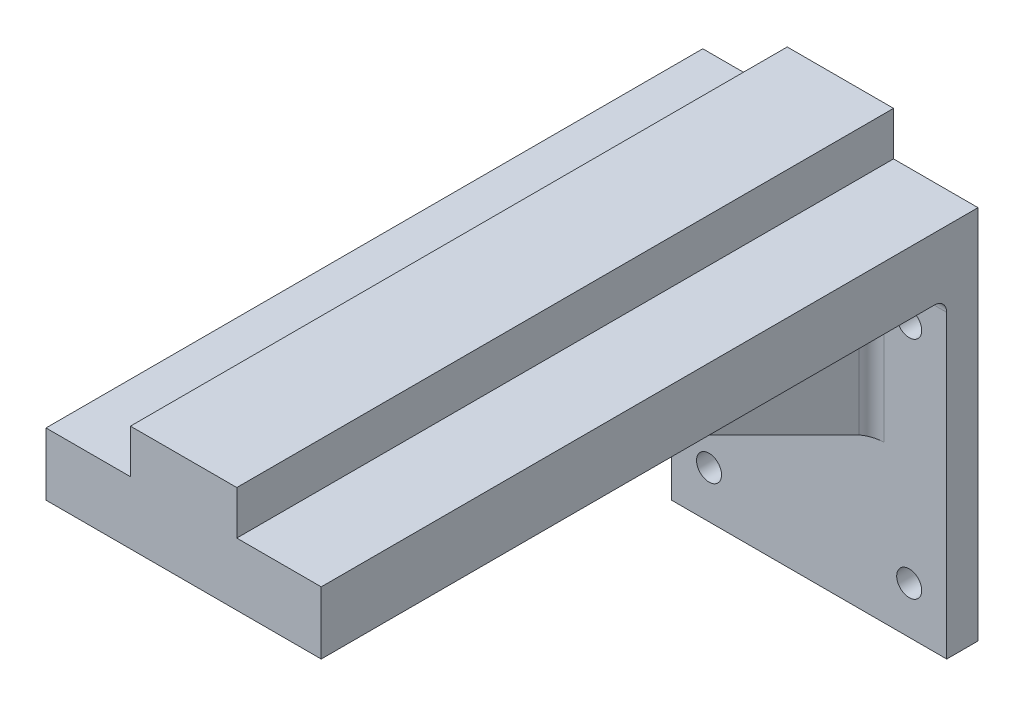
ISO-10303-21;
HEADER;
FILE_DESCRIPTION(('STEP AP214'),'2;1');
FILE_NAME('part.step','',(''),(''),'','','');
FILE_SCHEMA(('AUTOMOTIVE_DESIGN { 1 0 10303 214 1 1 1 1 }'));
ENDSEC;
DATA;
#1=APPLICATION_CONTEXT('core data for automotive mechanical design processes');
#2=APPLICATION_PROTOCOL_DEFINITION('international standard','automotive_design',2000,#1);
#3=PRODUCT_CONTEXT('',#1,'mechanical');
#4=PRODUCT('Part','Part','',(#3));
#5=PRODUCT_RELATED_PRODUCT_CATEGORY('part','',(#4));
#6=PRODUCT_DEFINITION_FORMATION('','',#4);
#7=PRODUCT_DEFINITION_CONTEXT('part definition',#1,'design');
#8=PRODUCT_DEFINITION('design','',#6,#7);
#9=PRODUCT_DEFINITION_SHAPE('','',#8);
#10=(LENGTH_UNIT() NAMED_UNIT(*) SI_UNIT(.MILLI.,.METRE.));
#11=(NAMED_UNIT(*) PLANE_ANGLE_UNIT() SI_UNIT($,.RADIAN.));
#12=(NAMED_UNIT(*) SI_UNIT($,.STERADIAN.) SOLID_ANGLE_UNIT());
#13=UNCERTAINTY_MEASURE_WITH_UNIT(LENGTH_MEASURE(1.E-05),#10,'distance_accuracy_value','');
#14=(GEOMETRIC_REPRESENTATION_CONTEXT(3) GLOBAL_UNCERTAINTY_ASSIGNED_CONTEXT((#13)) GLOBAL_UNIT_ASSIGNED_CONTEXT((#10,
#11,#12)) REPRESENTATION_CONTEXT('',''));
#15=CARTESIAN_POINT('',(0.,0.,0.));
#16=DIRECTION('',(0.,0.,1.));
#17=DIRECTION('',(1.,0.,0.));
#18=AXIS2_PLACEMENT_3D('',#15,#16,#17);
#19=CARTESIAN_POINT('',(-22.,60.,5.));
#20=DIRECTION('',(0.,-1.,0.));
#21=DIRECTION('',(0.,0.,-1.));
#22=AXIS2_PLACEMENT_3D('',#19,#20,#21);
#23=PLANE('',#22);
#24=DIRECTION('',(0.,0.,1.));
#25=VECTOR('',#24,1.);
#26=CARTESIAN_POINT('',(-8.5,60.,105.));
#27=LINE('',#26,#25);
#28=CARTESIAN_POINT('',(-8.5,60.,0.));
#29=VERTEX_POINT('',#28);
#30=CARTESIAN_POINT('',(-8.5,60.,105.));
#31=VERTEX_POINT('',#30);
#32=EDGE_CURVE('E180',#29,#31,#27,.T.);
#33=ORIENTED_EDGE('',*,*,#32,.F.);
#34=DIRECTION('',(-1.,0.,0.));
#35=VECTOR('',#34,1.);
#36=CARTESIAN_POINT('',(-22.,60.,0.));
#37=LINE('',#36,#35);
#38=CARTESIAN_POINT('',(-22.,60.,0.));
#39=VERTEX_POINT('',#38);
#40=EDGE_CURVE('E219',#29,#39,#37,.T.);
#41=ORIENTED_EDGE('',*,*,#40,.T.);
#42=DIRECTION('',(0.,0.,-1.));
#43=VECTOR('',#42,1.);
#44=CARTESIAN_POINT('',(-22.,60.,5.));
#45=LINE('',#44,#43);
#46=CARTESIAN_POINT('',(-22.,60.,105.));
#47=VERTEX_POINT('',#46);
#48=EDGE_CURVE('E243',#47,#39,#45,.T.);
#49=ORIENTED_EDGE('',*,*,#48,.F.);
#50=DIRECTION('',(-1.,0.,0.));
#51=VECTOR('',#50,1.);
#52=CARTESIAN_POINT('',(22.,60.,105.));
#53=LINE('',#52,#51);
#54=EDGE_CURVE('E49',#31,#47,#53,.T.);
#55=ORIENTED_EDGE('',*,*,#54,.F.);
#56=EDGE_LOOP('',(#33,#41,#49,#55));
#57=FACE_BOUND('',#56,.T.);
#58=ADVANCED_FACE('F32',(#57),#23,.F.);
#59=DIRECTION('',(0.,0.,-1.));
#60=VECTOR('',#59,1.);
#61=CARTESIAN_POINT('',(8.5,60.,0.));
#62=LINE('',#61,#60);
#63=CARTESIAN_POINT('',(8.5,60.,105.));
#64=VERTEX_POINT('',#63);
#65=CARTESIAN_POINT('',(8.5,60.,0.));
#66=VERTEX_POINT('',#65);
#67=EDGE_CURVE('E57',#64,#66,#62,.T.);
#68=ORIENTED_EDGE('',*,*,#67,.F.);
#69=CARTESIAN_POINT('',(22.,60.,105.));
#70=VERTEX_POINT('',#69);
#71=EDGE_CURVE('E231',#70,#64,#53,.T.);
#72=ORIENTED_EDGE('',*,*,#71,.F.);
#73=DIRECTION('',(0.,0.,-1.));
#74=VECTOR('',#73,1.);
#75=CARTESIAN_POINT('',(22.,60.,5.));
#76=LINE('',#75,#74);
#77=CARTESIAN_POINT('',(22.,60.,0.));
#78=VERTEX_POINT('',#77);
#79=EDGE_CURVE('E246',#70,#78,#76,.T.);
#80=ORIENTED_EDGE('',*,*,#79,.T.);
#81=EDGE_CURVE('E223',#78,#66,#37,.T.);
#82=ORIENTED_EDGE('',*,*,#81,.T.);
#83=EDGE_LOOP('',(#68,#72,#80,#82));
#84=FACE_BOUND('',#83,.T.);
#85=ADVANCED_FACE('F392',(#84),#23,.F.);
#86=CARTESIAN_POINT('',(0.,0.,5.));
#87=DIRECTION('',(0.,0.,-1.));
#88=DIRECTION('',(-1.,0.,0.));
#89=AXIS2_PLACEMENT_3D('',#86,#87,#88);
#90=PLANE('',#89);
#91=CARTESIAN_POINT('',(16.,43.5,5.));
#92=DIRECTION('',(0.,0.,-1.));
#93=DIRECTION('',(-1.,0.,0.));
#94=AXIS2_PLACEMENT_3D('',#91,#92,#93);
#95=CIRCLE('',#94,2.);
#96=CARTESIAN_POINT('',(14.,43.5,5.));
#97=VERTEX_POINT('',#96);
#98=EDGE_CURVE('E227',#97,#97,#95,.T.);
#99=ORIENTED_EDGE('',*,*,#98,.T.);
#100=EDGE_LOOP('',(#99));
#101=FACE_BOUND('',#100,.T.);
#102=CARTESIAN_POINT('',(-16.,43.5,5.));
#103=DIRECTION('',(0.,0.,-1.));
#104=DIRECTION('',(-1.,0.,0.));
#105=AXIS2_PLACEMENT_3D('',#102,#103,#104);
#106=CIRCLE('',#105,2.);
#107=CARTESIAN_POINT('',(-18.,43.5,5.));
#108=VERTEX_POINT('',#107);
#109=EDGE_CURVE('E362',#108,#108,#106,.T.);
#110=ORIENTED_EDGE('',*,*,#109,.T.);
#111=EDGE_LOOP('',(#110));
#112=FACE_BOUND('',#111,.T.);
#113=CARTESIAN_POINT('',(16.,7.49999999999999,5.));
#114=DIRECTION('',(0.,0.,-1.));
#115=DIRECTION('',(-1.,0.,0.));
#116=AXIS2_PLACEMENT_3D('',#113,#114,#115);
#117=CIRCLE('',#116,2.);
#118=CARTESIAN_POINT('',(14.,7.49999999999999,5.));
#119=VERTEX_POINT('',#118);
#120=EDGE_CURVE('E356',#119,#119,#117,.T.);
#121=ORIENTED_EDGE('',*,*,#120,.T.);
#122=EDGE_LOOP('',(#121));
#123=FACE_BOUND('',#122,.T.);
#124=CARTESIAN_POINT('',(-16.,7.49999999999999,5.));
#125=DIRECTION('',(0.,0.,-1.));
#126=DIRECTION('',(-1.,0.,0.));
#127=AXIS2_PLACEMENT_3D('',#124,#125,#126);
#128=CIRCLE('',#127,2.);
#129=CARTESIAN_POINT('',(-18.,7.49999999999999,5.));
#130=VERTEX_POINT('',#129);
#131=EDGE_CURVE('E339',#130,#130,#128,.T.);
#132=ORIENTED_EDGE('',*,*,#131,.T.);
#133=EDGE_LOOP('',(#132));
#134=FACE_BOUND('',#133,.T.);
#135=DIRECTION('',(0.,1.,0.));
#136=VECTOR('',#135,1.);
#137=CARTESIAN_POINT('',(22.,60.,5.));
#138=LINE('',#137,#136);
#139=CARTESIAN_POINT('',(22.,0.,5.));
#140=VERTEX_POINT('',#139);
#141=CARTESIAN_POINT('',(22.,48.,5.));
#142=VERTEX_POINT('',#141);
#143=EDGE_CURVE('E253',#140,#142,#138,.T.);
#144=ORIENTED_EDGE('',*,*,#143,.T.);
#145=DIRECTION('',(1.,0.,0.));
#146=VECTOR('',#145,1.);
#147=CARTESIAN_POINT('',(10.,48.,5.));
#148=LINE('',#147,#146);
#149=CARTESIAN_POINT('',(12.,48.,5.));
#150=VERTEX_POINT('',#149);
#151=EDGE_CURVE('E275',#142,#150,#148,.F.);
#152=ORIENTED_EDGE('',*,*,#151,.T.);
#153=DIRECTION('',(0.,1.,0.));
#154=VECTOR('',#153,1.);
#155=CARTESIAN_POINT('',(12.,0.,5.));
#156=LINE('',#155,#154);
#157=CARTESIAN_POINT('',(12.,25.,5.));
#158=VERTEX_POINT('',#157);
#159=EDGE_CURVE('E272',#150,#158,#156,.F.);
#160=ORIENTED_EDGE('',*,*,#159,.T.);
#161=DIRECTION('',(-1.,0.,0.));
#162=VECTOR('',#161,1.);
#163=CARTESIAN_POINT('',(10.,25.,5.));
#164=LINE('',#163,#162);
#165=CARTESIAN_POINT('',(-12.,25.,5.));
#166=VERTEX_POINT('',#165);
#167=EDGE_CURVE('E436',#158,#166,#164,.T.);
#168=ORIENTED_EDGE('',*,*,#167,.T.);
#169=DIRECTION('',(0.,1.,0.));
#170=VECTOR('',#169,1.);
#171=CARTESIAN_POINT('',(-12.,50.,5.));
#172=LINE('',#171,#170);
#173=CARTESIAN_POINT('',(-12.,48.,5.));
#174=VERTEX_POINT('',#173);
#175=EDGE_CURVE('E268',#166,#174,#172,.T.);
#176=ORIENTED_EDGE('',*,*,#175,.T.);
#177=DIRECTION('',(1.,0.,0.));
#178=VECTOR('',#177,1.);
#179=CARTESIAN_POINT('',(-22.,48.,5.));
#180=LINE('',#179,#178);
#181=CARTESIAN_POINT('',(-22.,48.,5.));
#182=VERTEX_POINT('',#181);
#183=EDGE_CURVE('E270',#174,#182,#180,.F.);
#184=ORIENTED_EDGE('',*,*,#183,.T.);
#185=DIRECTION('',(0.,-1.,0.));
#186=VECTOR('',#185,1.);
#187=CARTESIAN_POINT('',(-22.,0.,5.));
#188=LINE('',#187,#186);
#189=CARTESIAN_POINT('',(-22.,0.,5.));
#190=VERTEX_POINT('',#189);
#191=EDGE_CURVE('E244',#182,#190,#188,.T.);
#192=ORIENTED_EDGE('',*,*,#191,.T.);
#193=DIRECTION('',(1.,0.,0.));
#194=VECTOR('',#193,1.);
#195=CARTESIAN_POINT('',(22.,0.,5.));
#196=LINE('',#195,#194);
#197=EDGE_CURVE('E239',#190,#140,#196,.T.);
#198=ORIENTED_EDGE('',*,*,#197,.T.);
#199=EDGE_LOOP('',(#144,#152,#160,#168,#176,#184,#192,#198));
#200=FACE_BOUND('',#199,.T.);
#201=ADVANCED_FACE('F397',(#101,#112,#123,#134,#200),#90,.F.);
#202=CARTESIAN_POINT('',(22.,60.,5.));
#203=DIRECTION('',(-1.,0.,0.));
#204=DIRECTION('',(0.,0.,1.));
#205=AXIS2_PLACEMENT_3D('',#202,#203,#204);
#206=PLANE('',#205);
#207=DIRECTION('',(0.,1.,0.));
#208=VECTOR('',#207,1.);
#209=CARTESIAN_POINT('',(22.,60.,0.));
#210=LINE('',#209,#208);
#211=CARTESIAN_POINT('',(22.,0.,0.));
#212=VERTEX_POINT('',#211);
#213=EDGE_CURVE('E224',#212,#78,#210,.T.);
#214=ORIENTED_EDGE('',*,*,#213,.T.);
#215=ORIENTED_EDGE('',*,*,#79,.F.);
#216=DIRECTION('',(0.,1.,0.));
#217=VECTOR('',#216,1.);
#218=CARTESIAN_POINT('',(22.,50.,105.));
#219=LINE('',#218,#217);
#220=CARTESIAN_POINT('',(22.,50.,105.));
#221=VERTEX_POINT('',#220);
#222=EDGE_CURVE('E342',#221,#70,#219,.T.);
#223=ORIENTED_EDGE('',*,*,#222,.F.);
#224=DIRECTION('',(0.,0.,-1.));
#225=VECTOR('',#224,1.);
#226=CARTESIAN_POINT('',(22.,50.,105.));
#227=LINE('',#226,#225);
#228=CARTESIAN_POINT('',(22.,50.,7.00000000000001));
#229=VERTEX_POINT('',#228);
#230=EDGE_CURVE('E257',#221,#229,#227,.T.);
#231=ORIENTED_EDGE('',*,*,#230,.T.);
#232=CARTESIAN_POINT('',(22.,48.,7.00000000000001));
#233=DIRECTION('',(-1.,0.,0.));
#234=DIRECTION('',(0.,0.,1.));
#235=AXIS2_PLACEMENT_3D('',#232,#233,#234);
#236=CIRCLE('',#235,2.);
#237=EDGE_CURVE('E285',#229,#142,#236,.T.);
#238=ORIENTED_EDGE('',*,*,#237,.T.);
#239=ORIENTED_EDGE('',*,*,#143,.F.);
#240=DIRECTION('',(0.,0.,-1.));
#241=VECTOR('',#240,1.);
#242=CARTESIAN_POINT('',(22.,0.,5.));
#243=LINE('',#242,#241);
#244=EDGE_CURVE('E249',#140,#212,#243,.T.);
#245=ORIENTED_EDGE('',*,*,#244,.T.);
#246=EDGE_LOOP('',(#214,#215,#223,#231,#238,#239,#245));
#247=FACE_BOUND('',#246,.T.);
#248=ADVANCED_FACE('F400',(#247),#206,.F.);
#249=CARTESIAN_POINT('',(-22.,0.,5.));
#250=DIRECTION('',(1.,0.,0.));
#251=DIRECTION('',(0.,0.,-1.));
#252=AXIS2_PLACEMENT_3D('',#249,#250,#251);
#253=PLANE('',#252);
#254=DIRECTION('',(0.,-1.,0.));
#255=VECTOR('',#254,1.);
#256=CARTESIAN_POINT('',(-22.,0.,0.));
#257=LINE('',#256,#255);
#258=CARTESIAN_POINT('',(-22.,0.,0.));
#259=VERTEX_POINT('',#258);
#260=EDGE_CURVE('E221',#39,#259,#257,.T.);
#261=ORIENTED_EDGE('',*,*,#260,.T.);
#262=DIRECTION('',(0.,0.,-1.));
#263=VECTOR('',#262,1.);
#264=CARTESIAN_POINT('',(-22.,0.,5.));
#265=LINE('',#264,#263);
#266=EDGE_CURVE('E240',#190,#259,#265,.T.);
#267=ORIENTED_EDGE('',*,*,#266,.F.);
#268=ORIENTED_EDGE('',*,*,#191,.F.);
#269=CARTESIAN_POINT('',(-22.,48.,7.00000000000001));
#270=DIRECTION('',(1.,0.,0.));
#271=DIRECTION('',(0.,0.,-1.));
#272=AXIS2_PLACEMENT_3D('',#269,#270,#271);
#273=CIRCLE('',#272,2.);
#274=CARTESIAN_POINT('',(-22.,50.,7.00000000000001));
#275=VERTEX_POINT('',#274);
#276=EDGE_CURVE('E292',#182,#275,#273,.T.);
#277=ORIENTED_EDGE('',*,*,#276,.T.);
#278=DIRECTION('',(0.,0.,-1.));
#279=VECTOR('',#278,1.);
#280=CARTESIAN_POINT('',(-22.,50.,105.));
#281=LINE('',#280,#279);
#282=CARTESIAN_POINT('',(-22.,50.,105.));
#283=VERTEX_POINT('',#282);
#284=EDGE_CURVE('E328',#283,#275,#281,.T.);
#285=ORIENTED_EDGE('',*,*,#284,.F.);
#286=DIRECTION('',(0.,-1.,0.));
#287=VECTOR('',#286,1.);
#288=CARTESIAN_POINT('',(-22.,60.,105.));
#289=LINE('',#288,#287);
#290=EDGE_CURVE('E349',#47,#283,#289,.T.);
#291=ORIENTED_EDGE('',*,*,#290,.F.);
#292=ORIENTED_EDGE('',*,*,#48,.T.);
#293=EDGE_LOOP('',(#261,#267,#268,#277,#285,#291,#292));
#294=FACE_BOUND('',#293,.T.);
#295=ADVANCED_FACE('F385',(#294),#253,.F.);
#296=CARTESIAN_POINT('',(0.,0.,5.));
#297=DIRECTION('',(0.,1.,0.));
#298=DIRECTION('',(-1.,0.,0.));
#299=AXIS2_PLACEMENT_3D('',#296,#297,#298);
#300=PLANE('',#299);
#301=DIRECTION('',(1.,0.,0.));
#302=VECTOR('',#301,1.);
#303=CARTESIAN_POINT('',(0.,0.,0.));
#304=LINE('',#303,#302);
#305=EDGE_CURVE('E237',#259,#212,#304,.T.);
#306=ORIENTED_EDGE('',*,*,#305,.T.);
#307=ORIENTED_EDGE('',*,*,#244,.F.);
#308=ORIENTED_EDGE('',*,*,#197,.F.);
#309=ORIENTED_EDGE('',*,*,#266,.T.);
#310=EDGE_LOOP('',(#306,#307,#308,#309));
#311=FACE_BOUND('',#310,.T.);
#312=ADVANCED_FACE('F375',(#311),#300,.F.);
#313=CARTESIAN_POINT('',(0.,0.,0.));
#314=DIRECTION('',(0.,0.,-1.));
#315=DIRECTION('',(-1.,0.,0.));
#316=AXIS2_PLACEMENT_3D('',#313,#314,#315);
#317=PLANE('',#316);
#318=CARTESIAN_POINT('',(-16.,7.49999999999999,0.));
#319=DIRECTION('',(0.,0.,-1.));
#320=DIRECTION('',(-1.,0.,0.));
#321=AXIS2_PLACEMENT_3D('',#318,#319,#320);
#322=CIRCLE('',#321,2.);
#323=CARTESIAN_POINT('',(-18.,7.49999999999999,0.));
#324=VERTEX_POINT('',#323);
#325=EDGE_CURVE('E336',#324,#324,#322,.T.);
#326=ORIENTED_EDGE('',*,*,#325,.F.);
#327=EDGE_LOOP('',(#326));
#328=FACE_BOUND('',#327,.T.);
#329=CARTESIAN_POINT('',(16.,7.49999999999999,0.));
#330=DIRECTION('',(0.,0.,-1.));
#331=DIRECTION('',(-1.,0.,0.));
#332=AXIS2_PLACEMENT_3D('',#329,#330,#331);
#333=CIRCLE('',#332,2.);
#334=CARTESIAN_POINT('',(14.,7.49999999999999,0.));
#335=VERTEX_POINT('',#334);
#336=EDGE_CURVE('E354',#335,#335,#333,.T.);
#337=ORIENTED_EDGE('',*,*,#336,.F.);
#338=EDGE_LOOP('',(#337));
#339=FACE_BOUND('',#338,.T.);
#340=CARTESIAN_POINT('',(-16.,43.5,0.));
#341=DIRECTION('',(0.,0.,-1.));
#342=DIRECTION('',(-1.,0.,0.));
#343=AXIS2_PLACEMENT_3D('',#340,#341,#342);
#344=CIRCLE('',#343,2.);
#345=CARTESIAN_POINT('',(-18.,43.5,0.));
#346=VERTEX_POINT('',#345);
#347=EDGE_CURVE('E359',#346,#346,#344,.T.);
#348=ORIENTED_EDGE('',*,*,#347,.F.);
#349=EDGE_LOOP('',(#348));
#350=FACE_BOUND('',#349,.T.);
#351=CARTESIAN_POINT('',(16.,43.5,0.));
#352=DIRECTION('',(0.,0.,-1.));
#353=DIRECTION('',(-1.,0.,0.));
#354=AXIS2_PLACEMENT_3D('',#351,#352,#353);
#355=CIRCLE('',#354,2.);
#356=CARTESIAN_POINT('',(14.,43.5,0.));
#357=VERTEX_POINT('',#356);
#358=EDGE_CURVE('E365',#357,#357,#355,.T.);
#359=ORIENTED_EDGE('',*,*,#358,.F.);
#360=EDGE_LOOP('',(#359));
#361=FACE_BOUND('',#360,.T.);
#362=ORIENTED_EDGE('',*,*,#213,.F.);
#363=ORIENTED_EDGE('',*,*,#305,.F.);
#364=ORIENTED_EDGE('',*,*,#260,.F.);
#365=ORIENTED_EDGE('',*,*,#40,.F.);
#366=DIRECTION('',(0.,-1.,0.));
#367=VECTOR('',#366,1.);
#368=CARTESIAN_POINT('',(-8.5,67.,0.));
#369=LINE('',#368,#367);
#370=CARTESIAN_POINT('',(-8.5,67.,0.));
#371=VERTEX_POINT('',#370);
#372=EDGE_CURVE('E193',#371,#29,#369,.T.);
#373=ORIENTED_EDGE('',*,*,#372,.F.);
#374=DIRECTION('',(-1.,0.,0.));
#375=VECTOR('',#374,1.);
#376=CARTESIAN_POINT('',(-8.5,67.,0.));
#377=LINE('',#376,#375);
#378=CARTESIAN_POINT('',(8.5,67.,0.));
#379=VERTEX_POINT('',#378);
#380=EDGE_CURVE('E174',#379,#371,#377,.T.);
#381=ORIENTED_EDGE('',*,*,#380,.F.);
#382=DIRECTION('',(0.,-1.,0.));
#383=VECTOR('',#382,1.);
#384=CARTESIAN_POINT('',(8.5,67.,0.));
#385=LINE('',#384,#383);
#386=EDGE_CURVE('E185',#379,#66,#385,.T.);
#387=ORIENTED_EDGE('',*,*,#386,.T.);
#388=ORIENTED_EDGE('',*,*,#81,.F.);
#389=EDGE_LOOP('',(#362,#363,#364,#365,#373,#381,#387,#388));
#390=FACE_BOUND('',#389,.T.);
#391=ADVANCED_FACE('F216',(#328,#339,#350,#361,#390),#317,.T.);
#392=CARTESIAN_POINT('',(16.,43.5,5.));
#393=DIRECTION('',(0.,0.,-1.));
#394=DIRECTION('',(-1.,0.,0.));
#395=AXIS2_PLACEMENT_3D('',#392,#393,#394);
#396=CYLINDRICAL_SURFACE('',#395,2.);
#397=ORIENTED_EDGE('',*,*,#98,.F.);
#398=EDGE_LOOP('',(#397));
#399=FACE_BOUND('',#398,.T.);
#400=ORIENTED_EDGE('',*,*,#358,.T.);
#401=EDGE_LOOP('',(#400));
#402=FACE_BOUND('',#401,.T.);
#403=ADVANCED_FACE('F372',(#399,#402),#396,.F.);
#404=CARTESIAN_POINT('',(-16.,43.5,5.));
#405=DIRECTION('',(0.,0.,-1.));
#406=DIRECTION('',(-1.,0.,0.));
#407=AXIS2_PLACEMENT_3D('',#404,#405,#406);
#408=CYLINDRICAL_SURFACE('',#407,2.);
#409=ORIENTED_EDGE('',*,*,#109,.F.);
#410=EDGE_LOOP('',(#409));
#411=FACE_BOUND('',#410,.T.);
#412=ORIENTED_EDGE('',*,*,#347,.T.);
#413=EDGE_LOOP('',(#412));
#414=FACE_BOUND('',#413,.T.);
#415=ADVANCED_FACE('F382',(#411,#414),#408,.F.);
#416=CARTESIAN_POINT('',(16.,7.49999999999999,5.));
#417=DIRECTION('',(0.,0.,-1.));
#418=DIRECTION('',(-1.,0.,0.));
#419=AXIS2_PLACEMENT_3D('',#416,#417,#418);
#420=CYLINDRICAL_SURFACE('',#419,2.);
#421=ORIENTED_EDGE('',*,*,#120,.F.);
#422=EDGE_LOOP('',(#421));
#423=FACE_BOUND('',#422,.T.);
#424=ORIENTED_EDGE('',*,*,#336,.T.);
#425=EDGE_LOOP('',(#424));
#426=FACE_BOUND('',#425,.T.);
#427=ADVANCED_FACE('F487',(#423,#426),#420,.F.);
#428=CARTESIAN_POINT('',(-16.,7.49999999999999,5.));
#429=DIRECTION('',(0.,0.,-1.));
#430=DIRECTION('',(-1.,0.,0.));
#431=AXIS2_PLACEMENT_3D('',#428,#429,#430);
#432=CYLINDRICAL_SURFACE('',#431,2.);
#433=ORIENTED_EDGE('',*,*,#131,.F.);
#434=EDGE_LOOP('',(#433));
#435=FACE_BOUND('',#434,.T.);
#436=ORIENTED_EDGE('',*,*,#325,.T.);
#437=EDGE_LOOP('',(#436));
#438=FACE_BOUND('',#437,.T.);
#439=ADVANCED_FACE('F484',(#435,#438),#432,.F.);
#440=CARTESIAN_POINT('',(-22.,50.,105.));
#441=DIRECTION('',(0.,1.,0.));
#442=DIRECTION('',(0.,0.,1.));
#443=AXIS2_PLACEMENT_3D('',#440,#441,#442);
#444=PLANE('',#443);
#445=DIRECTION('',(0.,0.,1.));
#446=VECTOR('',#445,1.);
#447=CARTESIAN_POINT('',(12.,50.,105.));
#448=LINE('',#447,#446);
#449=CARTESIAN_POINT('',(12.,50.,55.));
#450=VERTEX_POINT('',#449);
#451=CARTESIAN_POINT('',(12.,50.,7.00000000000001));
#452=VERTEX_POINT('',#451);
#453=EDGE_CURVE('E331',#450,#452,#448,.F.);
#454=ORIENTED_EDGE('',*,*,#453,.T.);
#455=DIRECTION('',(1.,0.,0.));
#456=VECTOR('',#455,1.);
#457=CARTESIAN_POINT('',(22.,50.,7.00000000000001));
#458=LINE('',#457,#456);
#459=EDGE_CURVE('E266',#452,#229,#458,.T.);
#460=ORIENTED_EDGE('',*,*,#459,.T.);
#461=ORIENTED_EDGE('',*,*,#230,.F.);
#462=DIRECTION('',(1.,0.,0.));
#463=VECTOR('',#462,1.);
#464=CARTESIAN_POINT('',(-22.,50.,105.));
#465=LINE('',#464,#463);
#466=EDGE_CURVE('E347',#283,#221,#465,.T.);
#467=ORIENTED_EDGE('',*,*,#466,.F.);
#468=ORIENTED_EDGE('',*,*,#284,.T.);
#469=DIRECTION('',(1.,0.,0.));
#470=VECTOR('',#469,1.);
#471=CARTESIAN_POINT('',(-10.,50.,7.00000000000001));
#472=LINE('',#471,#470);
#473=CARTESIAN_POINT('',(-12.,50.,7.00000000000001));
#474=VERTEX_POINT('',#473);
#475=EDGE_CURVE('E321',#275,#474,#472,.T.);
#476=ORIENTED_EDGE('',*,*,#475,.T.);
#477=DIRECTION('',(0.,0.,1.));
#478=VECTOR('',#477,1.);
#479=CARTESIAN_POINT('',(-12.,50.,55.));
#480=LINE('',#479,#478);
#481=CARTESIAN_POINT('',(-12.,50.,55.));
#482=VERTEX_POINT('',#481);
#483=EDGE_CURVE('E252',#474,#482,#480,.T.);
#484=ORIENTED_EDGE('',*,*,#483,.T.);
#485=DIRECTION('',(-1.,0.,0.));
#486=VECTOR('',#485,1.);
#487=CARTESIAN_POINT('',(10.,50.,55.));
#488=LINE('',#487,#486);
#489=EDGE_CURVE('E442',#450,#482,#488,.T.);
#490=ORIENTED_EDGE('',*,*,#489,.F.);
#491=EDGE_LOOP('',(#454,#460,#461,#467,#468,#476,#484,#490));
#492=FACE_BOUND('',#491,.T.);
#493=ADVANCED_FACE('F325',(#492),#444,.F.);
#494=CARTESIAN_POINT('',(0.,0.,105.));
#495=DIRECTION('',(0.,0.,1.));
#496=DIRECTION('',(1.,0.,0.));
#497=AXIS2_PLACEMENT_3D('',#494,#495,#496);
#498=PLANE('',#497);
#499=ORIENTED_EDGE('',*,*,#71,.T.);
#500=DIRECTION('',(0.,-1.,0.));
#501=VECTOR('',#500,1.);
#502=CARTESIAN_POINT('',(8.5,67.,105.));
#503=LINE('',#502,#501);
#504=CARTESIAN_POINT('',(8.5,67.,105.));
#505=VERTEX_POINT('',#504);
#506=EDGE_CURVE('E165',#505,#64,#503,.T.);
#507=ORIENTED_EDGE('',*,*,#506,.F.);
#508=DIRECTION('',(1.,0.,0.));
#509=VECTOR('',#508,1.);
#510=CARTESIAN_POINT('',(8.5,67.,105.));
#511=LINE('',#510,#509);
#512=CARTESIAN_POINT('',(-8.5,67.,105.));
#513=VERTEX_POINT('',#512);
#514=EDGE_CURVE('E158',#513,#505,#511,.T.);
#515=ORIENTED_EDGE('',*,*,#514,.F.);
#516=DIRECTION('',(0.,-1.,0.));
#517=VECTOR('',#516,1.);
#518=CARTESIAN_POINT('',(-8.5,67.,105.));
#519=LINE('',#518,#517);
#520=EDGE_CURVE('E162',#513,#31,#519,.T.);
#521=ORIENTED_EDGE('',*,*,#520,.T.);
#522=ORIENTED_EDGE('',*,*,#54,.T.);
#523=ORIENTED_EDGE('',*,*,#290,.T.);
#524=ORIENTED_EDGE('',*,*,#466,.T.);
#525=ORIENTED_EDGE('',*,*,#222,.T.);
#526=EDGE_LOOP('',(#499,#507,#515,#521,#522,#523,#524,#525));
#527=FACE_BOUND('',#526,.T.);
#528=ADVANCED_FACE('F160',(#527),#498,.T.);
#529=CARTESIAN_POINT('',(10.,50.,55.));
#530=DIRECTION('',(0.,0.894427190999916,-0.447213595499958));
#531=DIRECTION('',(0.,0.447213595499958,0.894427190999916));
#532=AXIS2_PLACEMENT_3D('',#529,#530,#531);
#533=PLANE('',#532);
#534=ORIENTED_EDGE('',*,*,#489,.T.);
#535=CARTESIAN_POINT('',(-12.,48.,51.));
#536=DIRECTION('',(0.,0.894427190999916,-0.447213595499958));
#537=DIRECTION('',(0.,-0.447213595499958,-0.894427190999916));
#538=AXIS2_PLACEMENT_3D('',#535,#536,#537);
#539=ELLIPSE('',#538,4.47213595499958,2.);
#540=CARTESIAN_POINT('',(-10.,48.,51.));
#541=VERTEX_POINT('',#540);
#542=EDGE_CURVE('E11',#482,#541,#539,.T.);
#543=ORIENTED_EDGE('',*,*,#542,.T.);
#544=DIRECTION('',(0.,-0.447213595499958,-0.894427190999916));
#545=VECTOR('',#544,1.);
#546=CARTESIAN_POINT('',(-10.,50.,55.));
#547=LINE('',#546,#545);
#548=CARTESIAN_POINT('',(-10.,26.,7.));
#549=VERTEX_POINT('',#548);
#550=EDGE_CURVE('E305',#541,#549,#547,.T.);
#551=ORIENTED_EDGE('',*,*,#550,.T.);
#552=CARTESIAN_POINT('',(-12.,26.,7.));
#553=DIRECTION('',(0.,0.894427190999916,-0.447213595499958));
#554=DIRECTION('',(0.,-0.447213595499958,-0.894427190999916));
#555=AXIS2_PLACEMENT_3D('',#552,#553,#554);
#556=ELLIPSE('',#555,2.23606797749979,2.);
#557=EDGE_CURVE('E41',#549,#166,#556,.T.);
#558=ORIENTED_EDGE('',*,*,#557,.T.);
#559=ORIENTED_EDGE('',*,*,#167,.F.);
#560=CARTESIAN_POINT('',(12.,26.,7.));
#561=DIRECTION('',(0.,0.894427190999916,-0.447213595499958));
#562=DIRECTION('',(0.,0.447213595499958,0.894427190999916));
#563=AXIS2_PLACEMENT_3D('',#560,#561,#562);
#564=ELLIPSE('',#563,2.23606797749979,2.);
#565=CARTESIAN_POINT('',(10.,26.,7.));
#566=VERTEX_POINT('',#565);
#567=EDGE_CURVE('E287',#158,#566,#564,.T.);
#568=ORIENTED_EDGE('',*,*,#567,.T.);
#569=DIRECTION('',(0.,-0.447213595499958,-0.894427190999916));
#570=VECTOR('',#569,1.);
#571=CARTESIAN_POINT('',(10.,50.,55.));
#572=LINE('',#571,#570);
#573=CARTESIAN_POINT('',(10.,48.,51.));
#574=VERTEX_POINT('',#573);
#575=EDGE_CURVE('E200',#574,#566,#572,.T.);
#576=ORIENTED_EDGE('',*,*,#575,.F.);
#577=CARTESIAN_POINT('',(12.,48.,51.));
#578=DIRECTION('',(0.,0.894427190999916,-0.447213595499958));
#579=DIRECTION('',(0.,0.447213595499958,0.894427190999916));
#580=AXIS2_PLACEMENT_3D('',#577,#578,#579);
#581=ELLIPSE('',#580,4.47213595499958,2.);
#582=EDGE_CURVE('E289',#574,#450,#581,.T.);
#583=ORIENTED_EDGE('',*,*,#582,.T.);
#584=EDGE_LOOP('',(#534,#543,#551,#558,#559,#568,#576,#583));
#585=FACE_BOUND('',#584,.T.);
#586=ADVANCED_FACE('F435',(#585),#533,.F.);
#587=CARTESIAN_POINT('',(10.,0.,0.));
#588=DIRECTION('',(1.,0.,0.));
#589=DIRECTION('',(0.,0.,-1.));
#590=AXIS2_PLACEMENT_3D('',#587,#588,#589);
#591=PLANE('',#590);
#592=ORIENTED_EDGE('',*,*,#575,.T.);
#593=DIRECTION('',(0.,1.,0.));
#594=VECTOR('',#593,1.);
#595=CARTESIAN_POINT('',(10.,0.,7.));
#596=LINE('',#595,#594);
#597=CARTESIAN_POINT('',(10.,48.,7.));
#598=VERTEX_POINT('',#597);
#599=EDGE_CURVE('E279',#566,#598,#596,.T.);
#600=ORIENTED_EDGE('',*,*,#599,.T.);
#601=DIRECTION('',(0.,0.,1.));
#602=VECTOR('',#601,1.);
#603=CARTESIAN_POINT('',(10.,48.,0.));
#604=LINE('',#603,#602);
#605=EDGE_CURVE('E277',#598,#574,#604,.T.);
#606=ORIENTED_EDGE('',*,*,#605,.T.);
#607=EDGE_LOOP('',(#592,#600,#606));
#608=FACE_BOUND('',#607,.T.);
#609=ADVANCED_FACE('F464',(#608),#591,.T.);
#610=CARTESIAN_POINT('',(-10.,0.,0.));
#611=DIRECTION('',(1.,0.,0.));
#612=DIRECTION('',(0.,0.,-1.));
#613=AXIS2_PLACEMENT_3D('',#610,#611,#612);
#614=PLANE('',#613);
#615=DIRECTION('',(0.,0.,1.));
#616=VECTOR('',#615,1.);
#617=CARTESIAN_POINT('',(-10.,48.,5.));
#618=LINE('',#617,#616);
#619=CARTESIAN_POINT('',(-10.,48.,7.));
#620=VERTEX_POINT('',#619);
#621=EDGE_CURVE('E281',#541,#620,#618,.F.);
#622=ORIENTED_EDGE('',*,*,#621,.T.);
#623=DIRECTION('',(0.,1.,0.));
#624=VECTOR('',#623,1.);
#625=CARTESIAN_POINT('',(-10.,25.,7.));
#626=LINE('',#625,#624);
#627=EDGE_CURVE('E283',#620,#549,#626,.F.);
#628=ORIENTED_EDGE('',*,*,#627,.T.);
#629=ORIENTED_EDGE('',*,*,#550,.F.);
#630=EDGE_LOOP('',(#622,#628,#629));
#631=FACE_BOUND('',#630,.T.);
#632=ADVANCED_FACE('F418',(#631),#614,.F.);
#633=CARTESIAN_POINT('',(12.,0.,7.));
#634=DIRECTION('',(0.,1.,0.));
#635=DIRECTION('',(0.,0.,1.));
#636=AXIS2_PLACEMENT_3D('',#633,#634,#635);
#637=CYLINDRICAL_SURFACE('',#636,2.);
#638=ORIENTED_EDGE('',*,*,#567,.F.);
#639=ORIENTED_EDGE('',*,*,#159,.F.);
#640=CARTESIAN_POINT('',(12.,48.,7.));
#641=DIRECTION('',(0.,-1.,0.));
#642=DIRECTION('',(0.,0.,-1.));
#643=AXIS2_PLACEMENT_3D('',#640,#641,#642);
#644=CIRCLE('',#643,2.);
#645=EDGE_CURVE('E303',#598,#150,#644,.T.);
#646=ORIENTED_EDGE('',*,*,#645,.F.);
#647=ORIENTED_EDGE('',*,*,#599,.F.);
#648=EDGE_LOOP('',(#638,#639,#646,#647));
#649=FACE_BOUND('',#648,.T.);
#650=ADVANCED_FACE('F414',(#649),#637,.F.);
#651=CARTESIAN_POINT('',(12.,48.,0.));
#652=DIRECTION('',(0.,0.,1.));
#653=DIRECTION('',(1.,0.,0.));
#654=AXIS2_PLACEMENT_3D('',#651,#652,#653);
#655=CYLINDRICAL_SURFACE('',#654,2.);
#656=ORIENTED_EDGE('',*,*,#582,.F.);
#657=ORIENTED_EDGE('',*,*,#605,.F.);
#658=CARTESIAN_POINT('',(12.,48.,7.00000000000001));
#659=DIRECTION('',(0.,0.,1.));
#660=DIRECTION('',(1.,0.,0.));
#661=AXIS2_PLACEMENT_3D('',#658,#659,#660);
#662=CIRCLE('',#661,2.);
#663=EDGE_CURVE('E299',#452,#598,#662,.T.);
#664=ORIENTED_EDGE('',*,*,#663,.F.);
#665=ORIENTED_EDGE('',*,*,#453,.F.);
#666=EDGE_LOOP('',(#656,#657,#664,#665));
#667=FACE_BOUND('',#666,.T.);
#668=ADVANCED_FACE('F410',(#667),#655,.F.);
#669=CARTESIAN_POINT('',(12.,48.,7.));
#670=DIRECTION('',(0.,0.,1.));
#671=DIRECTION('',(1.,0.,0.));
#672=AXIS2_PLACEMENT_3D('',#669,#670,#671);
#673=SPHERICAL_SURFACE('',#672,2.);
#674=ORIENTED_EDGE('',*,*,#663,.T.);
#675=ORIENTED_EDGE('',*,*,#645,.T.);
#676=CARTESIAN_POINT('',(12.,48.,7.));
#677=DIRECTION('',(1.,0.,0.));
#678=DIRECTION('',(0.,0.,-1.));
#679=AXIS2_PLACEMENT_3D('',#676,#677,#678);
#680=CIRCLE('',#679,2.);
#681=EDGE_CURVE('E296',#452,#150,#680,.F.);
#682=ORIENTED_EDGE('',*,*,#681,.F.);
#683=EDGE_LOOP('',(#674,#675,#682));
#684=FACE_BOUND('',#683,.T.);
#685=ADVANCED_FACE('F406',(#684),#673,.F.);
#686=CARTESIAN_POINT('',(-22.,48.,7.00000000000001));
#687=DIRECTION('',(-1.,0.,0.));
#688=DIRECTION('',(0.,0.,1.));
#689=AXIS2_PLACEMENT_3D('',#686,#687,#688);
#690=CYLINDRICAL_SURFACE('',#689,2.);
#691=ORIENTED_EDGE('',*,*,#681,.T.);
#692=ORIENTED_EDGE('',*,*,#151,.F.);
#693=ORIENTED_EDGE('',*,*,#237,.F.);
#694=ORIENTED_EDGE('',*,*,#459,.F.);
#695=EDGE_LOOP('',(#691,#692,#693,#694));
#696=FACE_BOUND('',#695,.T.);
#697=ADVANCED_FACE('F403',(#696),#690,.F.);
#698=CARTESIAN_POINT('',(-12.,48.,105.));
#699=DIRECTION('',(0.,0.,-1.));
#700=DIRECTION('',(-1.,0.,0.));
#701=AXIS2_PLACEMENT_3D('',#698,#699,#700);
#702=CYLINDRICAL_SURFACE('',#701,2.);
#703=ORIENTED_EDGE('',*,*,#542,.F.);
#704=ORIENTED_EDGE('',*,*,#483,.F.);
#705=CARTESIAN_POINT('',(-12.,48.,7.));
#706=DIRECTION('',(0.,0.,1.));
#707=DIRECTION('',(0.,-1.,0.));
#708=AXIS2_PLACEMENT_3D('',#705,#706,#707);
#709=CIRCLE('',#708,2.);
#710=EDGE_CURVE('E300',#620,#474,#709,.T.);
#711=ORIENTED_EDGE('',*,*,#710,.F.);
#712=ORIENTED_EDGE('',*,*,#621,.F.);
#713=EDGE_LOOP('',(#703,#704,#711,#712));
#714=FACE_BOUND('',#713,.T.);
#715=ADVANCED_FACE('F34',(#714),#702,.F.);
#716=CARTESIAN_POINT('',(-12.,0.,7.));
#717=DIRECTION('',(0.,-1.,0.));
#718=DIRECTION('',(0.,0.,-1.));
#719=AXIS2_PLACEMENT_3D('',#716,#717,#718);
#720=CYLINDRICAL_SURFACE('',#719,2.);
#721=ORIENTED_EDGE('',*,*,#557,.F.);
#722=ORIENTED_EDGE('',*,*,#627,.F.);
#723=CARTESIAN_POINT('',(-12.,48.,7.));
#724=DIRECTION('',(0.,-1.,0.));
#725=DIRECTION('',(0.,0.,-1.));
#726=AXIS2_PLACEMENT_3D('',#723,#724,#725);
#727=CIRCLE('',#726,2.);
#728=EDGE_CURVE('E183',#174,#620,#727,.T.);
#729=ORIENTED_EDGE('',*,*,#728,.F.);
#730=ORIENTED_EDGE('',*,*,#175,.F.);
#731=EDGE_LOOP('',(#721,#722,#729,#730));
#732=FACE_BOUND('',#731,.T.);
#733=ADVANCED_FACE('F424',(#732),#720,.F.);
#734=CARTESIAN_POINT('',(-12.,48.,7.));
#735=DIRECTION('',(0.,0.,1.));
#736=DIRECTION('',(1.,0.,0.));
#737=AXIS2_PLACEMENT_3D('',#734,#735,#736);
#738=SPHERICAL_SURFACE('',#737,2.);
#739=ORIENTED_EDGE('',*,*,#728,.T.);
#740=ORIENTED_EDGE('',*,*,#710,.T.);
#741=CARTESIAN_POINT('',(-12.,48.,7.00000000000001));
#742=DIRECTION('',(-1.,0.,0.));
#743=DIRECTION('',(0.,0.,1.));
#744=AXIS2_PLACEMENT_3D('',#741,#742,#743);
#745=CIRCLE('',#744,2.);
#746=EDGE_CURVE('E181',#174,#474,#745,.F.);
#747=ORIENTED_EDGE('',*,*,#746,.F.);
#748=EDGE_LOOP('',(#739,#740,#747));
#749=FACE_BOUND('',#748,.T.);
#750=ADVANCED_FACE('F313',(#749),#738,.F.);
#751=CARTESIAN_POINT('',(-22.,48.,7.00000000000001));
#752=DIRECTION('',(-1.,0.,0.));
#753=DIRECTION('',(0.,0.,1.));
#754=AXIS2_PLACEMENT_3D('',#751,#752,#753);
#755=CYLINDRICAL_SURFACE('',#754,2.);
#756=ORIENTED_EDGE('',*,*,#276,.F.);
#757=ORIENTED_EDGE('',*,*,#183,.F.);
#758=ORIENTED_EDGE('',*,*,#746,.T.);
#759=ORIENTED_EDGE('',*,*,#475,.F.);
#760=EDGE_LOOP('',(#756,#757,#758,#759));
#761=FACE_BOUND('',#760,.T.);
#762=ADVANCED_FACE('F420',(#761),#755,.F.);
#763=CARTESIAN_POINT('',(-8.5,67.,105.));
#764=DIRECTION('',(1.,0.,0.));
#765=DIRECTION('',(0.,0.,-1.));
#766=AXIS2_PLACEMENT_3D('',#763,#764,#765);
#767=PLANE('',#766);
#768=ORIENTED_EDGE('',*,*,#32,.T.);
#769=ORIENTED_EDGE('',*,*,#520,.F.);
#770=DIRECTION('',(0.,0.,1.));
#771=VECTOR('',#770,1.);
#772=CARTESIAN_POINT('',(-8.5,67.,105.));
#773=LINE('',#772,#771);
#774=EDGE_CURVE('E169',#371,#513,#773,.T.);
#775=ORIENTED_EDGE('',*,*,#774,.F.);
#776=ORIENTED_EDGE('',*,*,#372,.T.);
#777=EDGE_LOOP('',(#768,#769,#775,#776));
#778=FACE_BOUND('',#777,.T.);
#779=ADVANCED_FACE('F179',(#778),#767,.F.);
#780=CARTESIAN_POINT('',(8.5,67.,0.));
#781=DIRECTION('',(-1.,0.,0.));
#782=DIRECTION('',(0.,0.,1.));
#783=AXIS2_PLACEMENT_3D('',#780,#781,#782);
#784=PLANE('',#783);
#785=ORIENTED_EDGE('',*,*,#67,.T.);
#786=ORIENTED_EDGE('',*,*,#386,.F.);
#787=DIRECTION('',(0.,0.,-1.));
#788=VECTOR('',#787,1.);
#789=CARTESIAN_POINT('',(8.5,67.,0.));
#790=LINE('',#789,#788);
#791=EDGE_CURVE('E168',#505,#379,#790,.T.);
#792=ORIENTED_EDGE('',*,*,#791,.F.);
#793=ORIENTED_EDGE('',*,*,#506,.T.);
#794=EDGE_LOOP('',(#785,#786,#792,#793));
#795=FACE_BOUND('',#794,.T.);
#796=ADVANCED_FACE('F214',(#795),#784,.F.);
#797=CARTESIAN_POINT('',(0.,67.,0.));
#798=DIRECTION('',(0.,-1.,0.));
#799=DIRECTION('',(0.,0.,-1.));
#800=AXIS2_PLACEMENT_3D('',#797,#798,#799);
#801=PLANE('',#800);
#802=ORIENTED_EDGE('',*,*,#774,.T.);
#803=ORIENTED_EDGE('',*,*,#514,.T.);
#804=ORIENTED_EDGE('',*,*,#791,.T.);
#805=ORIENTED_EDGE('',*,*,#380,.T.);
#806=EDGE_LOOP('',(#802,#803,#804,#805));
#807=FACE_BOUND('',#806,.T.);
#808=ADVANCED_FACE('F172',(#807),#801,.F.);
#809=CLOSED_SHELL('',(#58,#85,#201,#248,#295,#312,#391,#403,#415,#427,#439,#493,#528,#586,#609,
#632,#650,#668,#685,#697,#715,#733,#750,#762,#779,#796,#808));
#810=MANIFOLD_SOLID_BREP('B2',#809);
#811=ADVANCED_BREP_SHAPE_REPRESENTATION('',(#18,#810),#14);
#812=SHAPE_DEFINITION_REPRESENTATION(#9,#811);
ENDSEC;
END-ISO-10303-21;
